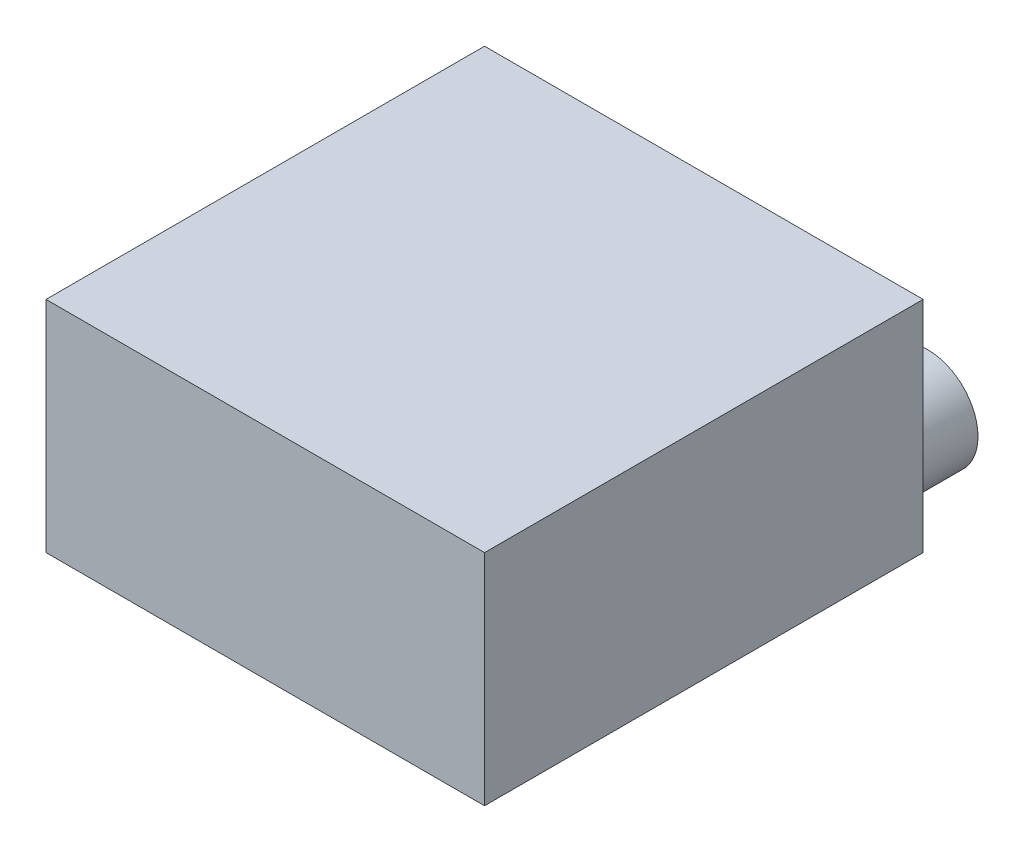
ISO-10303-21;
HEADER;
FILE_DESCRIPTION(('STEP AP214'),'2;1');
FILE_NAME('part.step','',(''),(''),'','','');
FILE_SCHEMA(('AUTOMOTIVE_DESIGN { 1 0 10303 214 1 1 1 1 }'));
ENDSEC;
DATA;
#1=APPLICATION_CONTEXT('core data for automotive mechanical design processes');
#2=APPLICATION_PROTOCOL_DEFINITION('international standard','automotive_design',2000,#1);
#3=PRODUCT_CONTEXT('',#1,'mechanical');
#4=PRODUCT('Part','Part','',(#3));
#5=PRODUCT_RELATED_PRODUCT_CATEGORY('part','',(#4));
#6=PRODUCT_DEFINITION_FORMATION('','',#4);
#7=PRODUCT_DEFINITION_CONTEXT('part definition',#1,'design');
#8=PRODUCT_DEFINITION('design','',#6,#7);
#9=PRODUCT_DEFINITION_SHAPE('','',#8);
#10=(LENGTH_UNIT() NAMED_UNIT(*) SI_UNIT(.MILLI.,.METRE.));
#11=(NAMED_UNIT(*) PLANE_ANGLE_UNIT() SI_UNIT($,.RADIAN.));
#12=(NAMED_UNIT(*) SI_UNIT($,.STERADIAN.) SOLID_ANGLE_UNIT());
#13=UNCERTAINTY_MEASURE_WITH_UNIT(LENGTH_MEASURE(1.E-05),#10,'distance_accuracy_value','');
#14=(GEOMETRIC_REPRESENTATION_CONTEXT(3) GLOBAL_UNCERTAINTY_ASSIGNED_CONTEXT((#13)) GLOBAL_UNIT_ASSIGNED_CONTEXT((#10,
#11,#12)) REPRESENTATION_CONTEXT('',''));
#15=CARTESIAN_POINT('',(0.,0.,0.));
#16=DIRECTION('',(0.,0.,1.));
#17=DIRECTION('',(1.,0.,0.));
#18=AXIS2_PLACEMENT_3D('',#15,#16,#17);
#19=CARTESIAN_POINT('',(-4.69849246231156,5.,-0.653266331658294));
#20=DIRECTION('',(1.,0.,0.));
#21=DIRECTION('',(0.,0.,-1.));
#22=AXIS2_PLACEMENT_3D('',#19,#20,#21);
#23=PLANE('',#22);
#24=DIRECTION('',(0.,0.,1.));
#25=VECTOR('',#24,1.);
#26=CARTESIAN_POINT('',(-4.69849246231156,0.,-0.653266331658294));
#27=LINE('',#26,#25);
#28=CARTESIAN_POINT('',(-4.69849246231156,0.,-0.653266331658294));
#29=VERTEX_POINT('',#28);
#30=CARTESIAN_POINT('',(-4.69849246231155,0.,9.34673366834171));
#31=VERTEX_POINT('',#30);
#32=EDGE_CURVE('E98',#29,#31,#27,.T.);
#33=ORIENTED_EDGE('',*,*,#32,.T.);
#34=DIRECTION('',(0.,-1.,0.));
#35=VECTOR('',#34,1.);
#36=CARTESIAN_POINT('',(-4.69849246231155,5.,9.34673366834171));
#37=LINE('',#36,#35);
#38=CARTESIAN_POINT('',(-4.69849246231155,5.,9.34673366834171));
#39=VERTEX_POINT('',#38);
#40=EDGE_CURVE('E40',#39,#31,#37,.T.);
#41=ORIENTED_EDGE('',*,*,#40,.F.);
#42=DIRECTION('',(0.,0.,1.));
#43=VECTOR('',#42,1.);
#44=CARTESIAN_POINT('',(-4.69849246231156,5.,-0.653266331658294));
#45=LINE('',#44,#43);
#46=CARTESIAN_POINT('',(-4.69849246231156,5.,-0.653266331658294));
#47=VERTEX_POINT('',#46);
#48=EDGE_CURVE('E84',#47,#39,#45,.T.);
#49=ORIENTED_EDGE('',*,*,#48,.F.);
#50=DIRECTION('',(0.,-1.,0.));
#51=VECTOR('',#50,1.);
#52=CARTESIAN_POINT('',(-4.69849246231156,5.,-0.653266331658294));
#53=LINE('',#52,#51);
#54=EDGE_CURVE('E94',#47,#29,#53,.T.);
#55=ORIENTED_EDGE('',*,*,#54,.T.);
#56=EDGE_LOOP('',(#33,#41,#49,#55));
#57=FACE_BOUND('',#56,.T.);
#58=ADVANCED_FACE('F32',(#57),#23,.F.);
#59=CARTESIAN_POINT('',(-4.69849246231155,5.,9.34673366834171));
#60=DIRECTION('',(0.,0.,-1.));
#61=DIRECTION('',(-1.,0.,0.));
#62=AXIS2_PLACEMENT_3D('',#59,#60,#61);
#63=PLANE('',#62);
#64=DIRECTION('',(1.,0.,0.));
#65=VECTOR('',#64,1.);
#66=CARTESIAN_POINT('',(-4.69849246231155,0.,9.34673366834171));
#67=LINE('',#66,#65);
#68=CARTESIAN_POINT('',(5.30150753768844,0.,9.34673366834171));
#69=VERTEX_POINT('',#68);
#70=EDGE_CURVE('E89',#31,#69,#67,.T.);
#71=ORIENTED_EDGE('',*,*,#70,.T.);
#72=DIRECTION('',(0.,-1.,0.));
#73=VECTOR('',#72,1.);
#74=CARTESIAN_POINT('',(5.30150753768844,5.,9.34673366834171));
#75=LINE('',#74,#73);
#76=CARTESIAN_POINT('',(5.30150753768844,5.,9.34673366834171));
#77=VERTEX_POINT('',#76);
#78=EDGE_CURVE('E87',#77,#69,#75,.T.);
#79=ORIENTED_EDGE('',*,*,#78,.F.);
#80=DIRECTION('',(1.,0.,0.));
#81=VECTOR('',#80,1.);
#82=CARTESIAN_POINT('',(-4.69849246231155,5.,9.34673366834171));
#83=LINE('',#82,#81);
#84=EDGE_CURVE('E79',#39,#77,#83,.T.);
#85=ORIENTED_EDGE('',*,*,#84,.F.);
#86=ORIENTED_EDGE('',*,*,#40,.T.);
#87=EDGE_LOOP('',(#71,#79,#85,#86));
#88=FACE_BOUND('',#87,.T.);
#89=ADVANCED_FACE('F88',(#88),#63,.F.);
#90=CARTESIAN_POINT('',(5.30150753768844,5.,-0.653266331658294));
#91=DIRECTION('',(-1.,0.,0.));
#92=DIRECTION('',(0.,0.,1.));
#93=AXIS2_PLACEMENT_3D('',#90,#91,#92);
#94=PLANE('',#93);
#95=DIRECTION('',(0.,0.,-1.));
#96=VECTOR('',#95,1.);
#97=CARTESIAN_POINT('',(5.30150753768844,0.,-0.653266331658294));
#98=LINE('',#97,#96);
#99=CARTESIAN_POINT('',(5.30150753768844,0.,-0.653266331658294));
#100=VERTEX_POINT('',#99);
#101=EDGE_CURVE('E65',#69,#100,#98,.T.);
#102=ORIENTED_EDGE('',*,*,#101,.T.);
#103=DIRECTION('',(0.,-1.,0.));
#104=VECTOR('',#103,1.);
#105=CARTESIAN_POINT('',(5.30150753768844,5.,-0.653266331658294));
#106=LINE('',#105,#104);
#107=CARTESIAN_POINT('',(5.30150753768844,5.,-0.653266331658294));
#108=VERTEX_POINT('',#107);
#109=EDGE_CURVE('E90',#108,#100,#106,.T.);
#110=ORIENTED_EDGE('',*,*,#109,.F.);
#111=DIRECTION('',(0.,0.,-1.));
#112=VECTOR('',#111,1.);
#113=CARTESIAN_POINT('',(5.30150753768844,5.,-0.653266331658294));
#114=LINE('',#113,#112);
#115=EDGE_CURVE('E82',#77,#108,#114,.T.);
#116=ORIENTED_EDGE('',*,*,#115,.F.);
#117=ORIENTED_EDGE('',*,*,#78,.T.);
#118=EDGE_LOOP('',(#102,#110,#116,#117));
#119=FACE_BOUND('',#118,.T.);
#120=ADVANCED_FACE('F92',(#119),#94,.F.);
#121=CARTESIAN_POINT('',(-4.69849246231156,5.,-0.653266331658294));
#122=DIRECTION('',(0.,0.,1.));
#123=DIRECTION('',(1.,0.,0.));
#124=AXIS2_PLACEMENT_3D('',#121,#122,#123);
#125=PLANE('',#124);
#126=CARTESIAN_POINT('',(3.90937804929714,1.41640749139401,-0.653266331658294));
#127=DIRECTION('',(0.,0.,1.));
#128=DIRECTION('',(1.,0.,0.));
#129=AXIS2_PLACEMENT_3D('',#126,#127,#128);
#130=CIRCLE('',#129,1.14344508698068);
#131=CARTESIAN_POINT('',(5.05282313627782,1.41640749139401,-0.653266331658294));
#132=VERTEX_POINT('',#131);
#133=EDGE_CURVE('E11',#132,#132,#130,.F.);
#134=ORIENTED_EDGE('',*,*,#133,.F.);
#135=EDGE_LOOP('',(#134));
#136=FACE_BOUND('',#135,.T.);
#137=DIRECTION('',(-1.,0.,0.));
#138=VECTOR('',#137,1.);
#139=CARTESIAN_POINT('',(-4.69849246231156,0.,-0.653266331658294));
#140=LINE('',#139,#138);
#141=EDGE_CURVE('E71',#100,#29,#140,.T.);
#142=ORIENTED_EDGE('',*,*,#141,.T.);
#143=ORIENTED_EDGE('',*,*,#54,.F.);
#144=DIRECTION('',(-1.,0.,0.));
#145=VECTOR('',#144,1.);
#146=CARTESIAN_POINT('',(-4.69849246231156,5.,-0.653266331658294));
#147=LINE('',#146,#145);
#148=EDGE_CURVE('E48',#108,#47,#147,.T.);
#149=ORIENTED_EDGE('',*,*,#148,.F.);
#150=ORIENTED_EDGE('',*,*,#109,.T.);
#151=EDGE_LOOP('',(#142,#143,#149,#150));
#152=FACE_BOUND('',#151,.T.);
#153=ADVANCED_FACE('F120',(#136,#152),#125,.F.);
#154=CARTESIAN_POINT('',(0.,5.,0.));
#155=DIRECTION('',(0.,1.,0.));
#156=DIRECTION('',(0.,0.,1.));
#157=AXIS2_PLACEMENT_3D('',#154,#155,#156);
#158=PLANE('',#157);
#159=ORIENTED_EDGE('',*,*,#48,.T.);
#160=ORIENTED_EDGE('',*,*,#84,.T.);
#161=ORIENTED_EDGE('',*,*,#115,.T.);
#162=ORIENTED_EDGE('',*,*,#148,.T.);
#163=EDGE_LOOP('',(#159,#160,#161,#162));
#164=FACE_BOUND('',#163,.T.);
#165=ADVANCED_FACE('F80',(#164),#158,.T.);
#166=CARTESIAN_POINT('',(0.,0.,0.));
#167=DIRECTION('',(0.,1.,0.));
#168=DIRECTION('',(0.,0.,1.));
#169=AXIS2_PLACEMENT_3D('',#166,#167,#168);
#170=PLANE('',#169);
#171=ORIENTED_EDGE('',*,*,#32,.F.);
#172=ORIENTED_EDGE('',*,*,#141,.F.);
#173=ORIENTED_EDGE('',*,*,#101,.F.);
#174=ORIENTED_EDGE('',*,*,#70,.F.);
#175=EDGE_LOOP('',(#171,#172,#173,#174));
#176=FACE_BOUND('',#175,.T.);
#177=ADVANCED_FACE('F109',(#176),#170,.F.);
#178=CARTESIAN_POINT('',(3.90937804929714,1.41640749139401,-2.15326633165829));
#179=DIRECTION('',(0.,0.,1.));
#180=DIRECTION('',(1.,0.,0.));
#181=AXIS2_PLACEMENT_3D('',#178,#179,#180);
#182=CYLINDRICAL_SURFACE('',#181,1.14344508698068);
#183=CARTESIAN_POINT('',(3.90937804929714,1.41640749139401,-2.15326633165829));
#184=DIRECTION('',(0.,0.,-1.));
#185=DIRECTION('',(-1.,0.,0.));
#186=AXIS2_PLACEMENT_3D('',#183,#184,#185);
#187=CIRCLE('',#186,1.14344508698068);
#188=CARTESIAN_POINT('',(2.76593296231646,1.41640749139401,-2.15326633165829));
#189=VERTEX_POINT('',#188);
#190=EDGE_CURVE('E101',#189,#189,#187,.T.);
#191=ORIENTED_EDGE('',*,*,#190,.F.);
#192=EDGE_LOOP('',(#191));
#193=FACE_BOUND('',#192,.T.);
#194=ORIENTED_EDGE('',*,*,#133,.T.);
#195=EDGE_LOOP('',(#194));
#196=FACE_BOUND('',#195,.T.);
#197=ADVANCED_FACE('F111',(#193,#196),#182,.T.);
#198=CARTESIAN_POINT('',(3.90937804929714,1.41640749139401,-2.15326633165829));
#199=DIRECTION('',(0.,0.,-1.));
#200=DIRECTION('',(-1.,0.,0.));
#201=AXIS2_PLACEMENT_3D('',#198,#199,#200);
#202=PLANE('',#201);
#203=ORIENTED_EDGE('',*,*,#190,.T.);
#204=EDGE_LOOP('',(#203));
#205=FACE_BOUND('',#204,.T.);
#206=ADVANCED_FACE('F117',(#205),#202,.T.);
#207=CLOSED_SHELL('',(#58,#89,#120,#153,#165,#177,#197,#206));
#208=MANIFOLD_SOLID_BREP('B2',#207);
#209=ADVANCED_BREP_SHAPE_REPRESENTATION('',(#18,#208),#14);
#210=SHAPE_DEFINITION_REPRESENTATION(#9,#209);
ENDSEC;
END-ISO-10303-21;
